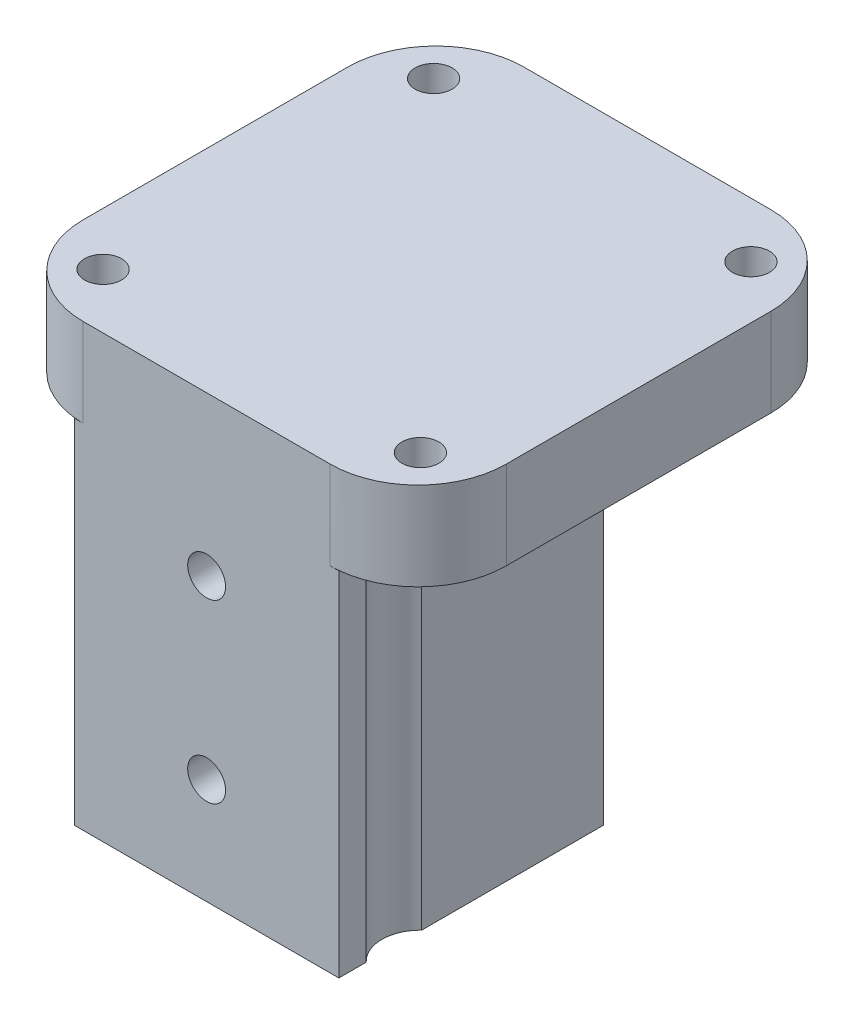
ISO-10303-21;
HEADER;
FILE_DESCRIPTION(('STEP AP214'),'2;1');
FILE_NAME('part.step','',(''),(''),'','','');
FILE_SCHEMA(('AUTOMOTIVE_DESIGN { 1 0 10303 214 1 1 1 1 }'));
ENDSEC;
DATA;
#1=APPLICATION_CONTEXT('core data for automotive mechanical design processes');
#2=APPLICATION_PROTOCOL_DEFINITION('international standard','automotive_design',2000,#1);
#3=PRODUCT_CONTEXT('',#1,'mechanical');
#4=PRODUCT('Part','Part','',(#3));
#5=PRODUCT_RELATED_PRODUCT_CATEGORY('part','',(#4));
#6=PRODUCT_DEFINITION_FORMATION('','',#4);
#7=PRODUCT_DEFINITION_CONTEXT('part definition',#1,'design');
#8=PRODUCT_DEFINITION('design','',#6,#7);
#9=PRODUCT_DEFINITION_SHAPE('','',#8);
#10=(LENGTH_UNIT() NAMED_UNIT(*) SI_UNIT(.MILLI.,.METRE.));
#11=(NAMED_UNIT(*) PLANE_ANGLE_UNIT() SI_UNIT($,.RADIAN.));
#12=(NAMED_UNIT(*) SI_UNIT($,.STERADIAN.) SOLID_ANGLE_UNIT());
#13=UNCERTAINTY_MEASURE_WITH_UNIT(LENGTH_MEASURE(1.E-05),#10,'distance_accuracy_value','');
#14=(GEOMETRIC_REPRESENTATION_CONTEXT(3) GLOBAL_UNCERTAINTY_ASSIGNED_CONTEXT((#13)) GLOBAL_UNIT_ASSIGNED_CONTEXT((#10,
#11,#12)) REPRESENTATION_CONTEXT('',''));
#15=CARTESIAN_POINT('',(0.,0.,0.));
#16=DIRECTION('',(0.,0.,1.));
#17=DIRECTION('',(1.,0.,0.));
#18=AXIS2_PLACEMENT_3D('',#15,#16,#17);
#19=CARTESIAN_POINT('',(0.,-40.,0.));
#20=DIRECTION('',(0.,-1.,0.));
#21=DIRECTION('',(0.,0.,-1.));
#22=AXIS2_PLACEMENT_3D('',#19,#20,#21);
#23=PLANE('',#22);
#24=DIRECTION('',(-1.,0.,0.));
#25=VECTOR('',#24,1.);
#26=CARTESIAN_POINT('',(-10.,-40.,20.));
#27=LINE('',#26,#25);
#28=CARTESIAN_POINT('',(10.,-40.,20.));
#29=VERTEX_POINT('',#28);
#30=CARTESIAN_POINT('',(-10.,-40.,20.));
#31=VERTEX_POINT('',#30);
#32=EDGE_CURVE('E271',#29,#31,#27,.T.);
#33=ORIENTED_EDGE('',*,*,#32,.F.);
#34=DIRECTION('',(0.,0.,1.));
#35=VECTOR('',#34,1.);
#36=CARTESIAN_POINT('',(10.,-40.,20.));
#37=LINE('',#36,#35);
#38=CARTESIAN_POINT('',(10.,-40.,0.));
#39=VERTEX_POINT('',#38);
#40=EDGE_CURVE('E260',#39,#29,#37,.T.);
#41=ORIENTED_EDGE('',*,*,#40,.F.);
#42=DIRECTION('',(1.,0.,0.));
#43=VECTOR('',#42,1.);
#44=CARTESIAN_POINT('',(-10.,-40.,0.));
#45=LINE('',#44,#43);
#46=CARTESIAN_POINT('',(-10.,-40.,0.));
#47=VERTEX_POINT('',#46);
#48=EDGE_CURVE('E251',#47,#39,#45,.T.);
#49=ORIENTED_EDGE('',*,*,#48,.F.);
#50=DIRECTION('',(0.,0.,-1.));
#51=VECTOR('',#50,1.);
#52=CARTESIAN_POINT('',(-10.,-40.,20.));
#53=LINE('',#52,#51);
#54=EDGE_CURVE('E266',#31,#47,#53,.T.);
#55=ORIENTED_EDGE('',*,*,#54,.F.);
#56=EDGE_LOOP('',(#33,#41,#49,#55));
#57=FACE_BOUND('',#56,.T.);
#58=CARTESIAN_POINT('',(18.,-40.,18.75));
#59=DIRECTION('',(0.,-1.,0.));
#60=DIRECTION('',(0.,0.,-1.));
#61=AXIS2_PLACEMENT_3D('',#58,#59,#60);
#62=CIRCLE('',#61,4.35);
#63=CARTESIAN_POINT('',(15.,-40.,21.9));
#64=VERTEX_POINT('',#63);
#65=CARTESIAN_POINT('',(15.,-40.,15.6));
#66=VERTEX_POINT('',#65);
#67=EDGE_CURVE('E267',#64,#66,#62,.T.);
#68=ORIENTED_EDGE('',*,*,#67,.F.);
#69=DIRECTION('',(0.,0.,1.));
#70=VECTOR('',#69,1.);
#71=CARTESIAN_POINT('',(15.,-40.,25.));
#72=LINE('',#71,#70);
#73=CARTESIAN_POINT('',(15.,-40.,25.));
#74=VERTEX_POINT('',#73);
#75=EDGE_CURVE('E218',#64,#74,#72,.T.);
#76=ORIENTED_EDGE('',*,*,#75,.T.);
#77=DIRECTION('',(-1.,0.,0.));
#78=VECTOR('',#77,1.);
#79=CARTESIAN_POINT('',(-15.,-40.,25.));
#80=LINE('',#79,#78);
#81=CARTESIAN_POINT('',(-15.,-40.,25.));
#82=VERTEX_POINT('',#81);
#83=EDGE_CURVE('E245',#74,#82,#80,.T.);
#84=ORIENTED_EDGE('',*,*,#83,.T.);
#85=DIRECTION('',(0.,0.,-1.));
#86=VECTOR('',#85,1.);
#87=CARTESIAN_POINT('',(-15.,-40.,25.));
#88=LINE('',#87,#86);
#89=CARTESIAN_POINT('',(-15.,-40.,21.9));
#90=VERTEX_POINT('',#89);
#91=EDGE_CURVE('E237',#82,#90,#88,.T.);
#92=ORIENTED_EDGE('',*,*,#91,.T.);
#93=CARTESIAN_POINT('',(-18.,-40.,18.75));
#94=DIRECTION('',(0.,-1.,0.));
#95=DIRECTION('',(0.,0.,-1.));
#96=AXIS2_PLACEMENT_3D('',#93,#94,#95);
#97=CIRCLE('',#96,4.35);
#98=CARTESIAN_POINT('',(-15.,-40.,15.6));
#99=VERTEX_POINT('',#98);
#100=EDGE_CURVE('E196',#99,#90,#97,.T.);
#101=ORIENTED_EDGE('',*,*,#100,.F.);
#102=CARTESIAN_POINT('',(-15.,-40.,-5.));
#103=VERTEX_POINT('',#102);
#104=EDGE_CURVE('E203',#99,#103,#88,.T.);
#105=ORIENTED_EDGE('',*,*,#104,.T.);
#106=DIRECTION('',(1.,0.,0.));
#107=VECTOR('',#106,1.);
#108=CARTESIAN_POINT('',(-15.,-40.,-5.));
#109=LINE('',#108,#107);
#110=CARTESIAN_POINT('',(15.,-40.,-5.));
#111=VERTEX_POINT('',#110);
#112=EDGE_CURVE('E236',#103,#111,#109,.T.);
#113=ORIENTED_EDGE('',*,*,#112,.T.);
#114=EDGE_CURVE('E225',#111,#66,#72,.T.);
#115=ORIENTED_EDGE('',*,*,#114,.T.);
#116=EDGE_LOOP('',(#68,#76,#84,#92,#101,#105,#113,#115));
#117=FACE_BOUND('',#116,.T.);
#118=ADVANCED_FACE('F39',(#57,#117),#23,.T.);
#119=CARTESIAN_POINT('',(15.,-40.,25.));
#120=DIRECTION('',(-1.,0.,0.));
#121=DIRECTION('',(0.,0.,1.));
#122=AXIS2_PLACEMENT_3D('',#119,#120,#121);
#123=PLANE('',#122);
#124=DIRECTION('',(0.,1.,0.));
#125=VECTOR('',#124,1.);
#126=CARTESIAN_POINT('',(15.,-40.,21.9));
#127=LINE('',#126,#125);
#128=CARTESIAN_POINT('',(15.,0.,21.9));
#129=VERTEX_POINT('',#128);
#130=EDGE_CURVE('E370',#129,#64,#127,.F.);
#131=ORIENTED_EDGE('',*,*,#130,.F.);
#132=DIRECTION('',(0.,0.,1.));
#133=VECTOR('',#132,1.);
#134=CARTESIAN_POINT('',(15.,0.,25.));
#135=LINE('',#134,#133);
#136=CARTESIAN_POINT('',(15.,0.,24.9498743710662));
#137=VERTEX_POINT('',#136);
#138=EDGE_CURVE('E234',#129,#137,#135,.T.);
#139=ORIENTED_EDGE('',*,*,#138,.T.);
#140=CARTESIAN_POINT('',(15.,0.,25.));
#141=VERTEX_POINT('',#140);
#142=EDGE_CURVE('E232',#137,#141,#135,.T.);
#143=ORIENTED_EDGE('',*,*,#142,.T.);
#144=DIRECTION('',(0.,1.,0.));
#145=VECTOR('',#144,1.);
#146=CARTESIAN_POINT('',(15.,-40.,25.));
#147=LINE('',#146,#145);
#148=EDGE_CURVE('E386',#74,#141,#147,.T.);
#149=ORIENTED_EDGE('',*,*,#148,.F.);
#150=ORIENTED_EDGE('',*,*,#75,.F.);
#151=EDGE_LOOP('',(#131,#139,#143,#149,#150));
#152=FACE_BOUND('',#151,.T.);
#153=ADVANCED_FACE('F441',(#152),#123,.F.);
#154=DIRECTION('',(0.,1.,0.));
#155=VECTOR('',#154,1.);
#156=CARTESIAN_POINT('',(15.,-40.,15.6));
#157=LINE('',#156,#155);
#158=CARTESIAN_POINT('',(15.,0.,15.6));
#159=VERTEX_POINT('',#158);
#160=EDGE_CURVE('E204',#66,#159,#157,.T.);
#161=ORIENTED_EDGE('',*,*,#160,.F.);
#162=ORIENTED_EDGE('',*,*,#114,.F.);
#163=DIRECTION('',(0.,1.,0.));
#164=VECTOR('',#163,1.);
#165=CARTESIAN_POINT('',(15.,-40.,-5.));
#166=LINE('',#165,#164);
#167=CARTESIAN_POINT('',(15.,-10.,-5.));
#168=VERTEX_POINT('',#167);
#169=EDGE_CURVE('E238',#111,#168,#166,.T.);
#170=ORIENTED_EDGE('',*,*,#169,.T.);
#171=CARTESIAN_POINT('',(15.,-10.,-15.));
#172=DIRECTION('',(-1.,0.,0.));
#173=DIRECTION('',(0.,0.,1.));
#174=AXIS2_PLACEMENT_3D('',#171,#172,#173);
#175=CIRCLE('',#174,10.);
#176=CARTESIAN_POINT('',(15.,0.,-15.));
#177=VERTEX_POINT('',#176);
#178=EDGE_CURVE('E50',#168,#177,#175,.T.);
#179=ORIENTED_EDGE('',*,*,#178,.T.);
#180=EDGE_CURVE('E53',#177,#159,#135,.T.);
#181=ORIENTED_EDGE('',*,*,#180,.T.);
#182=EDGE_LOOP('',(#161,#162,#170,#179,#181));
#183=FACE_BOUND('',#182,.T.);
#184=ADVANCED_FACE('F374',(#183),#123,.F.);
#185=CARTESIAN_POINT('',(-15.,-40.,25.));
#186=DIRECTION('',(1.,0.,0.));
#187=DIRECTION('',(0.,0.,-1.));
#188=AXIS2_PLACEMENT_3D('',#185,#186,#187);
#189=PLANE('',#188);
#190=DIRECTION('',(0.,1.,0.));
#191=VECTOR('',#190,1.);
#192=CARTESIAN_POINT('',(-15.,-40.,15.6));
#193=LINE('',#192,#191);
#194=CARTESIAN_POINT('',(-15.,0.,15.6));
#195=VERTEX_POINT('',#194);
#196=EDGE_CURVE('E188',#195,#99,#193,.F.);
#197=ORIENTED_EDGE('',*,*,#196,.F.);
#198=DIRECTION('',(0.,0.,-1.));
#199=VECTOR('',#198,1.);
#200=CARTESIAN_POINT('',(-15.,0.,25.));
#201=LINE('',#200,#199);
#202=CARTESIAN_POINT('',(-15.,0.,-15.));
#203=VERTEX_POINT('',#202);
#204=EDGE_CURVE('E64',#195,#203,#201,.T.);
#205=ORIENTED_EDGE('',*,*,#204,.T.);
#206=CARTESIAN_POINT('',(-15.,-10.,-15.));
#207=DIRECTION('',(1.,0.,0.));
#208=DIRECTION('',(0.,0.,-1.));
#209=AXIS2_PLACEMENT_3D('',#206,#207,#208);
#210=CIRCLE('',#209,10.);
#211=CARTESIAN_POINT('',(-15.,-10.,-5.));
#212=VERTEX_POINT('',#211);
#213=EDGE_CURVE('E11',#203,#212,#210,.T.);
#214=ORIENTED_EDGE('',*,*,#213,.T.);
#215=DIRECTION('',(0.,1.,0.));
#216=VECTOR('',#215,1.);
#217=CARTESIAN_POINT('',(-15.,-40.,-5.));
#218=LINE('',#217,#216);
#219=EDGE_CURVE('E382',#103,#212,#218,.T.);
#220=ORIENTED_EDGE('',*,*,#219,.F.);
#221=ORIENTED_EDGE('',*,*,#104,.F.);
#222=EDGE_LOOP('',(#197,#205,#214,#220,#221));
#223=FACE_BOUND('',#222,.T.);
#224=ADVANCED_FACE('F198',(#223),#189,.F.);
#225=DIRECTION('',(0.,1.,0.));
#226=VECTOR('',#225,1.);
#227=CARTESIAN_POINT('',(-15.,-40.,21.9));
#228=LINE('',#227,#226);
#229=CARTESIAN_POINT('',(-15.,0.,21.9));
#230=VERTEX_POINT('',#229);
#231=EDGE_CURVE('E195',#90,#230,#228,.T.);
#232=ORIENTED_EDGE('',*,*,#231,.F.);
#233=ORIENTED_EDGE('',*,*,#91,.F.);
#234=DIRECTION('',(0.,1.,0.));
#235=VECTOR('',#234,1.);
#236=CARTESIAN_POINT('',(-15.,-40.,25.));
#237=LINE('',#236,#235);
#238=CARTESIAN_POINT('',(-15.,0.,25.));
#239=VERTEX_POINT('',#238);
#240=EDGE_CURVE('E383',#82,#239,#237,.T.);
#241=ORIENTED_EDGE('',*,*,#240,.T.);
#242=CARTESIAN_POINT('',(-15.,0.,24.9498743710662));
#243=VERTEX_POINT('',#242);
#244=EDGE_CURVE('E211',#239,#243,#201,.T.);
#245=ORIENTED_EDGE('',*,*,#244,.T.);
#246=EDGE_CURVE('E209',#243,#230,#201,.T.);
#247=ORIENTED_EDGE('',*,*,#246,.T.);
#248=EDGE_LOOP('',(#232,#233,#241,#245,#247));
#249=FACE_BOUND('',#248,.T.);
#250=ADVANCED_FACE('F462',(#249),#189,.F.);
#251=CARTESIAN_POINT('',(-14.,0.,15.));
#252=DIRECTION('',(0.,1.,0.));
#253=DIRECTION('',(0.,0.,1.));
#254=AXIS2_PLACEMENT_3D('',#251,#252,#253);
#255=PLANE('',#254);
#256=ORIENTED_EDGE('',*,*,#180,.F.);
#257=DIRECTION('',(1.,0.,0.));
#258=VECTOR('',#257,1.);
#259=CARTESIAN_POINT('',(-15.,0.,-15.));
#260=LINE('',#259,#258);
#261=EDGE_CURVE('E210',#177,#203,#260,.F.);
#262=ORIENTED_EDGE('',*,*,#261,.T.);
#263=ORIENTED_EDGE('',*,*,#204,.F.);
#264=CARTESIAN_POINT('',(-18.,0.,18.75));
#265=DIRECTION('',(0.,-1.,0.));
#266=DIRECTION('',(0.,0.,-1.));
#267=AXIS2_PLACEMENT_3D('',#264,#265,#266);
#268=CIRCLE('',#267,4.35);
#269=EDGE_CURVE('E189',#195,#230,#268,.T.);
#270=ORIENTED_EDGE('',*,*,#269,.T.);
#271=ORIENTED_EDGE('',*,*,#246,.F.);
#272=CARTESIAN_POINT('',(-14.,0.,15.));
#273=DIRECTION('',(0.,1.,0.));
#274=DIRECTION('',(0.,0.,1.));
#275=AXIS2_PLACEMENT_3D('',#272,#273,#274);
#276=CIRCLE('',#275,10.);
#277=CARTESIAN_POINT('',(-24.,0.,15.));
#278=VERTEX_POINT('',#277);
#279=EDGE_CURVE('E324',#278,#243,#276,.T.);
#280=ORIENTED_EDGE('',*,*,#279,.F.);
#281=DIRECTION('',(0.,0.,1.));
#282=VECTOR('',#281,1.);
#283=CARTESIAN_POINT('',(-24.,0.,-15.));
#284=LINE('',#283,#282);
#285=CARTESIAN_POINT('',(-24.,0.,-15.));
#286=VERTEX_POINT('',#285);
#287=EDGE_CURVE('E345',#286,#278,#284,.T.);
#288=ORIENTED_EDGE('',*,*,#287,.F.);
#289=CARTESIAN_POINT('',(-14.,0.,-15.));
#290=DIRECTION('',(0.,1.,0.));
#291=DIRECTION('',(0.,0.,1.));
#292=AXIS2_PLACEMENT_3D('',#289,#290,#291);
#293=CIRCLE('',#292,10.);
#294=CARTESIAN_POINT('',(-14.,0.,-25.));
#295=VERTEX_POINT('',#294);
#296=EDGE_CURVE('E344',#295,#286,#293,.T.);
#297=ORIENTED_EDGE('',*,*,#296,.F.);
#298=DIRECTION('',(-1.,0.,0.));
#299=VECTOR('',#298,1.);
#300=CARTESIAN_POINT('',(-14.,0.,-25.));
#301=LINE('',#300,#299);
#302=CARTESIAN_POINT('',(14.,0.,-25.));
#303=VERTEX_POINT('',#302);
#304=EDGE_CURVE('E339',#303,#295,#301,.T.);
#305=ORIENTED_EDGE('',*,*,#304,.F.);
#306=CARTESIAN_POINT('',(14.,0.,-15.));
#307=DIRECTION('',(0.,1.,0.));
#308=DIRECTION('',(0.,0.,-1.));
#309=AXIS2_PLACEMENT_3D('',#306,#307,#308);
#310=CIRCLE('',#309,10.);
#311=CARTESIAN_POINT('',(24.,0.,-15.));
#312=VERTEX_POINT('',#311);
#313=EDGE_CURVE('E340',#312,#303,#310,.T.);
#314=ORIENTED_EDGE('',*,*,#313,.F.);
#315=DIRECTION('',(0.,0.,-1.));
#316=VECTOR('',#315,1.);
#317=CARTESIAN_POINT('',(24.,0.,-15.));
#318=LINE('',#317,#316);
#319=CARTESIAN_POINT('',(24.,0.,15.));
#320=VERTEX_POINT('',#319);
#321=EDGE_CURVE('E331',#320,#312,#318,.T.);
#322=ORIENTED_EDGE('',*,*,#321,.F.);
#323=CARTESIAN_POINT('',(14.,0.,15.));
#324=DIRECTION('',(0.,1.,0.));
#325=DIRECTION('',(0.,0.,1.));
#326=AXIS2_PLACEMENT_3D('',#323,#324,#325);
#327=CIRCLE('',#326,10.);
#328=EDGE_CURVE('E323',#137,#320,#327,.T.);
#329=ORIENTED_EDGE('',*,*,#328,.F.);
#330=ORIENTED_EDGE('',*,*,#138,.F.);
#331=CARTESIAN_POINT('',(18.,0.,18.75));
#332=DIRECTION('',(0.,-1.,0.));
#333=DIRECTION('',(0.,0.,-1.));
#334=AXIS2_PLACEMENT_3D('',#331,#332,#333);
#335=CIRCLE('',#334,4.35);
#336=EDGE_CURVE('E192',#129,#159,#335,.T.);
#337=ORIENTED_EDGE('',*,*,#336,.T.);
#338=EDGE_LOOP('',(#256,#262,#263,#270,#271,#280,#288,#297,#305,#314,#322,#329,#330,#337));
#339=FACE_BOUND('',#338,.T.);
#340=CARTESIAN_POINT('',(-18.,0.,-18.75));
#341=DIRECTION('',(0.,1.,0.));
#342=DIRECTION('',(0.,0.,1.));
#343=AXIS2_PLACEMENT_3D('',#340,#341,#342);
#344=CIRCLE('',#343,2.1);
#345=CARTESIAN_POINT('',(-18.,0.,-16.65));
#346=VERTEX_POINT('',#345);
#347=EDGE_CURVE('E326',#346,#346,#344,.T.);
#348=ORIENTED_EDGE('',*,*,#347,.T.);
#349=EDGE_LOOP('',(#348));
#350=FACE_BOUND('',#349,.T.);
#351=CARTESIAN_POINT('',(18.,0.,-18.75));
#352=DIRECTION('',(0.,1.,0.));
#353=DIRECTION('',(0.,0.,1.));
#354=AXIS2_PLACEMENT_3D('',#351,#352,#353);
#355=CIRCLE('',#354,2.1);
#356=CARTESIAN_POINT('',(18.,0.,-16.65));
#357=VERTEX_POINT('',#356);
#358=EDGE_CURVE('E402',#357,#357,#355,.T.);
#359=ORIENTED_EDGE('',*,*,#358,.T.);
#360=EDGE_LOOP('',(#359));
#361=FACE_BOUND('',#360,.T.);
#362=CARTESIAN_POINT('',(-18.,0.,18.75));
#363=DIRECTION('',(0.,1.,0.));
#364=DIRECTION('',(0.,0.,1.));
#365=AXIS2_PLACEMENT_3D('',#362,#363,#364);
#366=CIRCLE('',#365,2.1);
#367=CARTESIAN_POINT('',(-18.,0.,20.85));
#368=VERTEX_POINT('',#367);
#369=EDGE_CURVE('E391',#368,#368,#366,.T.);
#370=ORIENTED_EDGE('',*,*,#369,.T.);
#371=EDGE_LOOP('',(#370));
#372=FACE_BOUND('',#371,.T.);
#373=CARTESIAN_POINT('',(18.,0.,18.75));
#374=DIRECTION('',(0.,1.,0.));
#375=DIRECTION('',(0.,0.,1.));
#376=AXIS2_PLACEMENT_3D('',#373,#374,#375);
#377=CIRCLE('',#376,2.1);
#378=CARTESIAN_POINT('',(18.,0.,20.85));
#379=VERTEX_POINT('',#378);
#380=EDGE_CURVE('E394',#379,#379,#377,.T.);
#381=ORIENTED_EDGE('',*,*,#380,.T.);
#382=EDGE_LOOP('',(#381));
#383=FACE_BOUND('',#382,.T.);
#384=ADVANCED_FACE('F205',(#339,#350,#361,#372,#383),#255,.F.);
#385=CARTESIAN_POINT('',(-14.,10.,15.));
#386=DIRECTION('',(0.,1.,0.));
#387=DIRECTION('',(0.,0.,1.));
#388=AXIS2_PLACEMENT_3D('',#385,#386,#387);
#389=PLANE('',#388);
#390=CARTESIAN_POINT('',(18.,10.,18.75));
#391=DIRECTION('',(0.,1.,0.));
#392=DIRECTION('',(0.,0.,1.));
#393=AXIS2_PLACEMENT_3D('',#390,#391,#392);
#394=CIRCLE('',#393,2.1);
#395=CARTESIAN_POINT('',(18.,10.,20.85));
#396=VERTEX_POINT('',#395);
#397=EDGE_CURVE('E397',#396,#396,#394,.T.);
#398=ORIENTED_EDGE('',*,*,#397,.F.);
#399=EDGE_LOOP('',(#398));
#400=FACE_BOUND('',#399,.T.);
#401=CARTESIAN_POINT('',(-18.,10.,-18.75));
#402=DIRECTION('',(0.,1.,0.));
#403=DIRECTION('',(0.,0.,1.));
#404=AXIS2_PLACEMENT_3D('',#401,#402,#403);
#405=CIRCLE('',#404,2.1);
#406=CARTESIAN_POINT('',(-18.,10.,-16.65));
#407=VERTEX_POINT('',#406);
#408=EDGE_CURVE('E321',#407,#407,#405,.T.);
#409=ORIENTED_EDGE('',*,*,#408,.F.);
#410=EDGE_LOOP('',(#409));
#411=FACE_BOUND('',#410,.T.);
#412=CARTESIAN_POINT('',(-14.,10.,15.));
#413=DIRECTION('',(0.,1.,0.));
#414=DIRECTION('',(0.,0.,1.));
#415=AXIS2_PLACEMENT_3D('',#412,#413,#414);
#416=CIRCLE('',#415,10.);
#417=CARTESIAN_POINT('',(-24.,10.,15.));
#418=VERTEX_POINT('',#417);
#419=CARTESIAN_POINT('',(-14.,10.,25.));
#420=VERTEX_POINT('',#419);
#421=EDGE_CURVE('E342',#418,#420,#416,.T.);
#422=ORIENTED_EDGE('',*,*,#421,.T.);
#423=DIRECTION('',(1.,0.,0.));
#424=VECTOR('',#423,1.);
#425=CARTESIAN_POINT('',(-14.,10.,25.));
#426=LINE('',#425,#424);
#427=CARTESIAN_POINT('',(14.,10.,25.));
#428=VERTEX_POINT('',#427);
#429=EDGE_CURVE('E315',#420,#428,#426,.T.);
#430=ORIENTED_EDGE('',*,*,#429,.T.);
#431=CARTESIAN_POINT('',(14.,10.,15.));
#432=DIRECTION('',(0.,1.,0.));
#433=DIRECTION('',(0.,0.,1.));
#434=AXIS2_PLACEMENT_3D('',#431,#432,#433);
#435=CIRCLE('',#434,10.);
#436=CARTESIAN_POINT('',(24.,10.,15.));
#437=VERTEX_POINT('',#436);
#438=EDGE_CURVE('E412',#428,#437,#435,.T.);
#439=ORIENTED_EDGE('',*,*,#438,.T.);
#440=DIRECTION('',(0.,0.,-1.));
#441=VECTOR('',#440,1.);
#442=CARTESIAN_POINT('',(24.,10.,-15.));
#443=LINE('',#442,#441);
#444=CARTESIAN_POINT('',(24.,10.,-15.));
#445=VERTEX_POINT('',#444);
#446=EDGE_CURVE('E414',#437,#445,#443,.T.);
#447=ORIENTED_EDGE('',*,*,#446,.T.);
#448=CARTESIAN_POINT('',(14.,10.,-15.));
#449=DIRECTION('',(0.,1.,0.));
#450=DIRECTION('',(0.,0.,-1.));
#451=AXIS2_PLACEMENT_3D('',#448,#449,#450);
#452=CIRCLE('',#451,10.);
#453=CARTESIAN_POINT('',(14.,10.,-25.));
#454=VERTEX_POINT('',#453);
#455=EDGE_CURVE('E419',#445,#454,#452,.T.);
#456=ORIENTED_EDGE('',*,*,#455,.T.);
#457=DIRECTION('',(-1.,0.,0.));
#458=VECTOR('',#457,1.);
#459=CARTESIAN_POINT('',(-14.,10.,-25.));
#460=LINE('',#459,#458);
#461=CARTESIAN_POINT('',(-14.,10.,-25.));
#462=VERTEX_POINT('',#461);
#463=EDGE_CURVE('E420',#454,#462,#460,.T.);
#464=ORIENTED_EDGE('',*,*,#463,.T.);
#465=CARTESIAN_POINT('',(-14.,10.,-15.));
#466=DIRECTION('',(0.,1.,0.));
#467=DIRECTION('',(0.,0.,1.));
#468=AXIS2_PLACEMENT_3D('',#465,#466,#467);
#469=CIRCLE('',#468,10.);
#470=CARTESIAN_POINT('',(-24.,10.,-15.));
#471=VERTEX_POINT('',#470);
#472=EDGE_CURVE('E416',#462,#471,#469,.T.);
#473=ORIENTED_EDGE('',*,*,#472,.T.);
#474=DIRECTION('',(0.,0.,1.));
#475=VECTOR('',#474,1.);
#476=CARTESIAN_POINT('',(-24.,10.,-15.));
#477=LINE('',#476,#475);
#478=EDGE_CURVE('E329',#471,#418,#477,.T.);
#479=ORIENTED_EDGE('',*,*,#478,.T.);
#480=EDGE_LOOP('',(#422,#430,#439,#447,#456,#464,#473,#479));
#481=FACE_BOUND('',#480,.T.);
#482=CARTESIAN_POINT('',(18.,10.,-18.75));
#483=DIRECTION('',(0.,1.,0.));
#484=DIRECTION('',(0.,0.,1.));
#485=AXIS2_PLACEMENT_3D('',#482,#483,#484);
#486=CIRCLE('',#485,2.1);
#487=CARTESIAN_POINT('',(18.,10.,-16.65));
#488=VERTEX_POINT('',#487);
#489=EDGE_CURVE('E404',#488,#488,#486,.T.);
#490=ORIENTED_EDGE('',*,*,#489,.F.);
#491=EDGE_LOOP('',(#490));
#492=FACE_BOUND('',#491,.T.);
#493=CARTESIAN_POINT('',(-18.,10.,18.75));
#494=DIRECTION('',(0.,1.,0.));
#495=DIRECTION('',(0.,0.,1.));
#496=AXIS2_PLACEMENT_3D('',#493,#494,#495);
#497=CIRCLE('',#496,2.1);
#498=CARTESIAN_POINT('',(-18.,10.,20.85));
#499=VERTEX_POINT('',#498);
#500=EDGE_CURVE('E395',#499,#499,#497,.T.);
#501=ORIENTED_EDGE('',*,*,#500,.F.);
#502=EDGE_LOOP('',(#501));
#503=FACE_BOUND('',#502,.T.);
#504=ADVANCED_FACE('F428',(#400,#411,#481,#492,#503),#389,.T.);
#505=CARTESIAN_POINT('',(-14.,10.,15.));
#506=DIRECTION('',(0.,-1.,0.));
#507=DIRECTION('',(0.,0.,-1.));
#508=AXIS2_PLACEMENT_3D('',#505,#506,#507);
#509=CYLINDRICAL_SURFACE('',#508,10.);
#510=ORIENTED_EDGE('',*,*,#279,.T.);
#511=CARTESIAN_POINT('',(-14.,0.,25.));
#512=VERTEX_POINT('',#511);
#513=EDGE_CURVE('E316',#243,#512,#276,.T.);
#514=ORIENTED_EDGE('',*,*,#513,.T.);
#515=DIRECTION('',(0.,-1.,0.));
#516=VECTOR('',#515,1.);
#517=CARTESIAN_POINT('',(-14.,10.,25.));
#518=LINE('',#517,#516);
#519=EDGE_CURVE('E208',#420,#512,#518,.T.);
#520=ORIENTED_EDGE('',*,*,#519,.F.);
#521=ORIENTED_EDGE('',*,*,#421,.F.);
#522=DIRECTION('',(0.,-1.,0.));
#523=VECTOR('',#522,1.);
#524=CARTESIAN_POINT('',(-24.,10.,15.));
#525=LINE('',#524,#523);
#526=EDGE_CURVE('E346',#418,#278,#525,.T.);
#527=ORIENTED_EDGE('',*,*,#526,.T.);
#528=EDGE_LOOP('',(#510,#514,#520,#521,#527));
#529=FACE_BOUND('',#528,.T.);
#530=ADVANCED_FACE('F306',(#529),#509,.T.);
#531=CARTESIAN_POINT('',(-14.,10.,25.));
#532=DIRECTION('',(0.,0.,-1.));
#533=DIRECTION('',(-1.,0.,0.));
#534=AXIS2_PLACEMENT_3D('',#531,#532,#533);
#535=PLANE('',#534);
#536=CARTESIAN_POINT('',(0.,-8.,25.));
#537=DIRECTION('',(0.,0.,1.));
#538=DIRECTION('',(1.,0.,0.));
#539=AXIS2_PLACEMENT_3D('',#536,#537,#538);
#540=CIRCLE('',#539,2.15);
#541=CARTESIAN_POINT('',(2.15,-8.,25.));
#542=VERTEX_POINT('',#541);
#543=EDGE_CURVE('E279',#542,#542,#540,.T.);
#544=ORIENTED_EDGE('',*,*,#543,.F.);
#545=EDGE_LOOP('',(#544));
#546=FACE_BOUND('',#545,.T.);
#547=CARTESIAN_POINT('',(0.,-28.,25.));
#548=DIRECTION('',(0.,0.,1.));
#549=DIRECTION('',(1.,0.,0.));
#550=AXIS2_PLACEMENT_3D('',#547,#548,#549);
#551=CIRCLE('',#550,2.15);
#552=CARTESIAN_POINT('',(2.15,-28.,25.));
#553=VERTEX_POINT('',#552);
#554=EDGE_CURVE('E283',#553,#553,#551,.T.);
#555=ORIENTED_EDGE('',*,*,#554,.F.);
#556=EDGE_LOOP('',(#555));
#557=FACE_BOUND('',#556,.T.);
#558=ORIENTED_EDGE('',*,*,#519,.T.);
#559=DIRECTION('',(-1.,0.,0.));
#560=VECTOR('',#559,1.);
#561=CARTESIAN_POINT('',(-15.,0.,25.));
#562=LINE('',#561,#560);
#563=EDGE_CURVE('E227',#512,#239,#562,.T.);
#564=ORIENTED_EDGE('',*,*,#563,.T.);
#565=ORIENTED_EDGE('',*,*,#240,.F.);
#566=ORIENTED_EDGE('',*,*,#83,.F.);
#567=ORIENTED_EDGE('',*,*,#148,.T.);
#568=CARTESIAN_POINT('',(14.,0.,25.));
#569=VERTEX_POINT('',#568);
#570=EDGE_CURVE('E219',#141,#569,#562,.T.);
#571=ORIENTED_EDGE('',*,*,#570,.T.);
#572=DIRECTION('',(0.,-1.,0.));
#573=VECTOR('',#572,1.);
#574=CARTESIAN_POINT('',(14.,10.,25.));
#575=LINE('',#574,#573);
#576=EDGE_CURVE('E213',#428,#569,#575,.T.);
#577=ORIENTED_EDGE('',*,*,#576,.F.);
#578=ORIENTED_EDGE('',*,*,#429,.F.);
#579=EDGE_LOOP('',(#558,#564,#565,#566,#567,#571,#577,#578));
#580=FACE_BOUND('',#579,.T.);
#581=ADVANCED_FACE('F305',(#546,#557,#580),#535,.F.);
#582=CARTESIAN_POINT('',(14.,10.,15.));
#583=DIRECTION('',(0.,-1.,0.));
#584=DIRECTION('',(0.,0.,-1.));
#585=AXIS2_PLACEMENT_3D('',#582,#583,#584);
#586=CYLINDRICAL_SURFACE('',#585,10.);
#587=EDGE_CURVE('E334',#569,#137,#327,.T.);
#588=ORIENTED_EDGE('',*,*,#587,.T.);
#589=ORIENTED_EDGE('',*,*,#328,.T.);
#590=DIRECTION('',(0.,-1.,0.));
#591=VECTOR('',#590,1.);
#592=CARTESIAN_POINT('',(24.,10.,15.));
#593=LINE('',#592,#591);
#594=EDGE_CURVE('E363',#437,#320,#593,.T.);
#595=ORIENTED_EDGE('',*,*,#594,.F.);
#596=ORIENTED_EDGE('',*,*,#438,.F.);
#597=ORIENTED_EDGE('',*,*,#576,.T.);
#598=EDGE_LOOP('',(#588,#589,#595,#596,#597));
#599=FACE_BOUND('',#598,.T.);
#600=ADVANCED_FACE('F304',(#599),#586,.T.);
#601=CARTESIAN_POINT('',(24.,10.,-15.));
#602=DIRECTION('',(-1.,0.,0.));
#603=DIRECTION('',(0.,0.,1.));
#604=AXIS2_PLACEMENT_3D('',#601,#602,#603);
#605=PLANE('',#604);
#606=ORIENTED_EDGE('',*,*,#321,.T.);
#607=DIRECTION('',(0.,-1.,0.));
#608=VECTOR('',#607,1.);
#609=CARTESIAN_POINT('',(24.,10.,-15.));
#610=LINE('',#609,#608);
#611=EDGE_CURVE('E356',#445,#312,#610,.T.);
#612=ORIENTED_EDGE('',*,*,#611,.F.);
#613=ORIENTED_EDGE('',*,*,#446,.F.);
#614=ORIENTED_EDGE('',*,*,#594,.T.);
#615=EDGE_LOOP('',(#606,#612,#613,#614));
#616=FACE_BOUND('',#615,.T.);
#617=ADVANCED_FACE('F500',(#616),#605,.F.);
#618=CARTESIAN_POINT('',(14.,10.,-15.));
#619=DIRECTION('',(0.,-1.,0.));
#620=DIRECTION('',(0.,0.,-1.));
#621=AXIS2_PLACEMENT_3D('',#618,#619,#620);
#622=CYLINDRICAL_SURFACE('',#621,10.);
#623=ORIENTED_EDGE('',*,*,#313,.T.);
#624=DIRECTION('',(0.,-1.,0.));
#625=VECTOR('',#624,1.);
#626=CARTESIAN_POINT('',(14.,10.,-25.));
#627=LINE('',#626,#625);
#628=EDGE_CURVE('E351',#454,#303,#627,.T.);
#629=ORIENTED_EDGE('',*,*,#628,.F.);
#630=ORIENTED_EDGE('',*,*,#455,.F.);
#631=ORIENTED_EDGE('',*,*,#611,.T.);
#632=EDGE_LOOP('',(#623,#629,#630,#631));
#633=FACE_BOUND('',#632,.T.);
#634=ADVANCED_FACE('F491',(#633),#622,.T.);
#635=CARTESIAN_POINT('',(-14.,10.,-25.));
#636=DIRECTION('',(0.,0.,1.));
#637=DIRECTION('',(1.,0.,0.));
#638=AXIS2_PLACEMENT_3D('',#635,#636,#637);
#639=PLANE('',#638);
#640=ORIENTED_EDGE('',*,*,#304,.T.);
#641=DIRECTION('',(0.,-1.,0.));
#642=VECTOR('',#641,1.);
#643=CARTESIAN_POINT('',(-14.,10.,-25.));
#644=LINE('',#643,#642);
#645=EDGE_CURVE('E354',#462,#295,#644,.T.);
#646=ORIENTED_EDGE('',*,*,#645,.F.);
#647=ORIENTED_EDGE('',*,*,#463,.F.);
#648=ORIENTED_EDGE('',*,*,#628,.T.);
#649=EDGE_LOOP('',(#640,#646,#647,#648));
#650=FACE_BOUND('',#649,.T.);
#651=ADVANCED_FACE('F490',(#650),#639,.F.);
#652=CARTESIAN_POINT('',(-14.,10.,-15.));
#653=DIRECTION('',(0.,-1.,0.));
#654=DIRECTION('',(0.,0.,-1.));
#655=AXIS2_PLACEMENT_3D('',#652,#653,#654);
#656=CYLINDRICAL_SURFACE('',#655,10.);
#657=ORIENTED_EDGE('',*,*,#296,.T.);
#658=DIRECTION('',(0.,-1.,0.));
#659=VECTOR('',#658,1.);
#660=CARTESIAN_POINT('',(-24.,10.,-15.));
#661=LINE('',#660,#659);
#662=EDGE_CURVE('E348',#471,#286,#661,.T.);
#663=ORIENTED_EDGE('',*,*,#662,.F.);
#664=ORIENTED_EDGE('',*,*,#472,.F.);
#665=ORIENTED_EDGE('',*,*,#645,.T.);
#666=EDGE_LOOP('',(#657,#663,#664,#665));
#667=FACE_BOUND('',#666,.T.);
#668=ADVANCED_FACE('F488',(#667),#656,.T.);
#669=CARTESIAN_POINT('',(-24.,10.,-15.));
#670=DIRECTION('',(1.,0.,0.));
#671=DIRECTION('',(0.,0.,-1.));
#672=AXIS2_PLACEMENT_3D('',#669,#670,#671);
#673=PLANE('',#672);
#674=ORIENTED_EDGE('',*,*,#287,.T.);
#675=ORIENTED_EDGE('',*,*,#526,.F.);
#676=ORIENTED_EDGE('',*,*,#478,.F.);
#677=ORIENTED_EDGE('',*,*,#662,.T.);
#678=EDGE_LOOP('',(#674,#675,#676,#677));
#679=FACE_BOUND('',#678,.T.);
#680=ADVANCED_FACE('F429',(#679),#673,.F.);
#681=CARTESIAN_POINT('',(-18.,10.,-18.75));
#682=DIRECTION('',(0.,-1.,0.));
#683=DIRECTION('',(0.,0.,-1.));
#684=AXIS2_PLACEMENT_3D('',#681,#682,#683);
#685=CYLINDRICAL_SURFACE('',#684,2.1);
#686=ORIENTED_EDGE('',*,*,#408,.T.);
#687=EDGE_LOOP('',(#686));
#688=FACE_BOUND('',#687,.T.);
#689=ORIENTED_EDGE('',*,*,#347,.F.);
#690=EDGE_LOOP('',(#689));
#691=FACE_BOUND('',#690,.T.);
#692=ADVANCED_FACE('F472',(#688,#691),#685,.F.);
#693=CARTESIAN_POINT('',(18.,10.,-18.75));
#694=DIRECTION('',(0.,-1.,0.));
#695=DIRECTION('',(0.,0.,-1.));
#696=AXIS2_PLACEMENT_3D('',#693,#694,#695);
#697=CYLINDRICAL_SURFACE('',#696,2.1);
#698=ORIENTED_EDGE('',*,*,#489,.T.);
#699=EDGE_LOOP('',(#698));
#700=FACE_BOUND('',#699,.T.);
#701=ORIENTED_EDGE('',*,*,#358,.F.);
#702=EDGE_LOOP('',(#701));
#703=FACE_BOUND('',#702,.T.);
#704=ADVANCED_FACE('F474',(#700,#703),#697,.F.);
#705=CARTESIAN_POINT('',(18.,10.,18.75));
#706=DIRECTION('',(0.,-1.,0.));
#707=DIRECTION('',(0.,0.,-1.));
#708=AXIS2_PLACEMENT_3D('',#705,#706,#707);
#709=CYLINDRICAL_SURFACE('',#708,2.1);
#710=ORIENTED_EDGE('',*,*,#397,.T.);
#711=EDGE_LOOP('',(#710));
#712=FACE_BOUND('',#711,.T.);
#713=ORIENTED_EDGE('',*,*,#380,.F.);
#714=EDGE_LOOP('',(#713));
#715=FACE_BOUND('',#714,.T.);
#716=ADVANCED_FACE('F470',(#712,#715),#709,.F.);
#717=CARTESIAN_POINT('',(-18.,10.,18.75));
#718=DIRECTION('',(0.,-1.,0.));
#719=DIRECTION('',(0.,0.,-1.));
#720=AXIS2_PLACEMENT_3D('',#717,#718,#719);
#721=CYLINDRICAL_SURFACE('',#720,2.1);
#722=ORIENTED_EDGE('',*,*,#500,.T.);
#723=EDGE_LOOP('',(#722));
#724=FACE_BOUND('',#723,.T.);
#725=ORIENTED_EDGE('',*,*,#369,.F.);
#726=EDGE_LOOP('',(#725));
#727=FACE_BOUND('',#726,.T.);
#728=ADVANCED_FACE('F461',(#724,#727),#721,.F.);
#729=CARTESIAN_POINT('',(0.,0.,0.));
#730=DIRECTION('',(0.,-1.,0.));
#731=DIRECTION('',(0.,0.,-1.));
#732=AXIS2_PLACEMENT_3D('',#729,#730,#731);
#733=PLANE('',#732);
#734=ORIENTED_EDGE('',*,*,#513,.F.);
#735=ORIENTED_EDGE('',*,*,#244,.F.);
#736=ORIENTED_EDGE('',*,*,#563,.F.);
#737=EDGE_LOOP('',(#734,#735,#736));
#738=FACE_BOUND('',#737,.T.);
#739=ADVANCED_FACE('F319',(#738),#733,.F.);
#740=ORIENTED_EDGE('',*,*,#587,.F.);
#741=ORIENTED_EDGE('',*,*,#570,.F.);
#742=ORIENTED_EDGE('',*,*,#142,.F.);
#743=EDGE_LOOP('',(#740,#741,#742));
#744=FACE_BOUND('',#743,.T.);
#745=ADVANCED_FACE('F456',(#744),#733,.F.);
#746=CARTESIAN_POINT('',(-15.,-40.,-5.));
#747=DIRECTION('',(0.,0.,1.));
#748=DIRECTION('',(1.,0.,0.));
#749=AXIS2_PLACEMENT_3D('',#746,#747,#748);
#750=PLANE('',#749);
#751=ORIENTED_EDGE('',*,*,#219,.T.);
#752=DIRECTION('',(1.,0.,0.));
#753=VECTOR('',#752,1.);
#754=CARTESIAN_POINT('',(15.,-10.,-5.));
#755=LINE('',#754,#753);
#756=EDGE_CURVE('E367',#212,#168,#755,.T.);
#757=ORIENTED_EDGE('',*,*,#756,.T.);
#758=ORIENTED_EDGE('',*,*,#169,.F.);
#759=ORIENTED_EDGE('',*,*,#112,.F.);
#760=EDGE_LOOP('',(#751,#757,#758,#759));
#761=FACE_BOUND('',#760,.T.);
#762=ADVANCED_FACE('F381',(#761),#750,.F.);
#763=CARTESIAN_POINT('',(10.,-40.,20.));
#764=DIRECTION('',(-1.,0.,0.));
#765=DIRECTION('',(0.,0.,1.));
#766=AXIS2_PLACEMENT_3D('',#763,#764,#765);
#767=PLANE('',#766);
#768=DIRECTION('',(0.,0.,1.));
#769=VECTOR('',#768,1.);
#770=CARTESIAN_POINT('',(10.,0.,20.));
#771=LINE('',#770,#769);
#772=CARTESIAN_POINT('',(10.,0.,0.));
#773=VERTEX_POINT('',#772);
#774=CARTESIAN_POINT('',(10.,0.,20.));
#775=VERTEX_POINT('',#774);
#776=EDGE_CURVE('E264',#773,#775,#771,.T.);
#777=ORIENTED_EDGE('',*,*,#776,.F.);
#778=DIRECTION('',(0.,1.,0.));
#779=VECTOR('',#778,1.);
#780=CARTESIAN_POINT('',(10.,-40.,0.));
#781=LINE('',#780,#779);
#782=EDGE_CURVE('E255',#39,#773,#781,.T.);
#783=ORIENTED_EDGE('',*,*,#782,.F.);
#784=ORIENTED_EDGE('',*,*,#40,.T.);
#785=DIRECTION('',(0.,1.,0.));
#786=VECTOR('',#785,1.);
#787=CARTESIAN_POINT('',(10.,-40.,20.));
#788=LINE('',#787,#786);
#789=EDGE_CURVE('E244',#29,#775,#788,.T.);
#790=ORIENTED_EDGE('',*,*,#789,.T.);
#791=EDGE_LOOP('',(#777,#783,#784,#790));
#792=FACE_BOUND('',#791,.T.);
#793=ADVANCED_FACE('F453',(#792),#767,.T.);
#794=CARTESIAN_POINT('',(-10.,-40.,20.));
#795=DIRECTION('',(0.,0.,-1.));
#796=DIRECTION('',(-1.,0.,0.));
#797=AXIS2_PLACEMENT_3D('',#794,#795,#796);
#798=PLANE('',#797);
#799=CARTESIAN_POINT('',(0.,-8.,20.));
#800=DIRECTION('',(0.,0.,-1.));
#801=DIRECTION('',(-1.,0.,0.));
#802=AXIS2_PLACEMENT_3D('',#799,#800,#801);
#803=CIRCLE('',#802,2.15);
#804=CARTESIAN_POINT('',(-2.15,-8.,20.));
#805=VERTEX_POINT('',#804);
#806=EDGE_CURVE('E282',#805,#805,#803,.F.);
#807=ORIENTED_EDGE('',*,*,#806,.T.);
#808=EDGE_LOOP('',(#807));
#809=FACE_BOUND('',#808,.T.);
#810=CARTESIAN_POINT('',(0.,-28.,20.));
#811=DIRECTION('',(0.,0.,-1.));
#812=DIRECTION('',(-1.,0.,0.));
#813=AXIS2_PLACEMENT_3D('',#810,#811,#812);
#814=CIRCLE('',#813,2.15);
#815=CARTESIAN_POINT('',(-2.15,-28.,20.));
#816=VERTEX_POINT('',#815);
#817=EDGE_CURVE('E277',#816,#816,#814,.F.);
#818=ORIENTED_EDGE('',*,*,#817,.T.);
#819=EDGE_LOOP('',(#818));
#820=FACE_BOUND('',#819,.T.);
#821=DIRECTION('',(-1.,0.,0.));
#822=VECTOR('',#821,1.);
#823=CARTESIAN_POINT('',(-10.,0.,20.));
#824=LINE('',#823,#822);
#825=CARTESIAN_POINT('',(-10.,0.,20.));
#826=VERTEX_POINT('',#825);
#827=EDGE_CURVE('E265',#775,#826,#824,.T.);
#828=ORIENTED_EDGE('',*,*,#827,.F.);
#829=ORIENTED_EDGE('',*,*,#789,.F.);
#830=ORIENTED_EDGE('',*,*,#32,.T.);
#831=DIRECTION('',(0.,1.,0.));
#832=VECTOR('',#831,1.);
#833=CARTESIAN_POINT('',(-10.,-40.,20.));
#834=LINE('',#833,#832);
#835=EDGE_CURVE('E247',#31,#826,#834,.T.);
#836=ORIENTED_EDGE('',*,*,#835,.T.);
#837=EDGE_LOOP('',(#828,#829,#830,#836));
#838=FACE_BOUND('',#837,.T.);
#839=ADVANCED_FACE('F292',(#809,#820,#838),#798,.T.);
#840=CARTESIAN_POINT('',(-10.,-40.,20.));
#841=DIRECTION('',(1.,0.,0.));
#842=DIRECTION('',(0.,0.,-1.));
#843=AXIS2_PLACEMENT_3D('',#840,#841,#842);
#844=PLANE('',#843);
#845=DIRECTION('',(0.,0.,-1.));
#846=VECTOR('',#845,1.);
#847=CARTESIAN_POINT('',(-10.,0.,20.));
#848=LINE('',#847,#846);
#849=CARTESIAN_POINT('',(-10.,0.,0.));
#850=VERTEX_POINT('',#849);
#851=EDGE_CURVE('E258',#826,#850,#848,.T.);
#852=ORIENTED_EDGE('',*,*,#851,.F.);
#853=ORIENTED_EDGE('',*,*,#835,.F.);
#854=ORIENTED_EDGE('',*,*,#54,.T.);
#855=DIRECTION('',(0.,1.,0.));
#856=VECTOR('',#855,1.);
#857=CARTESIAN_POINT('',(-10.,-40.,0.));
#858=LINE('',#857,#856);
#859=EDGE_CURVE('E249',#47,#850,#858,.T.);
#860=ORIENTED_EDGE('',*,*,#859,.T.);
#861=EDGE_LOOP('',(#852,#853,#854,#860));
#862=FACE_BOUND('',#861,.T.);
#863=ADVANCED_FACE('F545',(#862),#844,.T.);
#864=CARTESIAN_POINT('',(-10.,-40.,0.));
#865=DIRECTION('',(0.,0.,1.));
#866=DIRECTION('',(1.,0.,0.));
#867=AXIS2_PLACEMENT_3D('',#864,#865,#866);
#868=PLANE('',#867);
#869=DIRECTION('',(1.,0.,0.));
#870=VECTOR('',#869,1.);
#871=CARTESIAN_POINT('',(-10.,0.,0.));
#872=LINE('',#871,#870);
#873=EDGE_CURVE('E253',#850,#773,#872,.T.);
#874=ORIENTED_EDGE('',*,*,#873,.F.);
#875=ORIENTED_EDGE('',*,*,#859,.F.);
#876=ORIENTED_EDGE('',*,*,#48,.T.);
#877=ORIENTED_EDGE('',*,*,#782,.T.);
#878=EDGE_LOOP('',(#874,#875,#876,#877));
#879=FACE_BOUND('',#878,.T.);
#880=ADVANCED_FACE('F484',(#879),#868,.T.);
#881=ORIENTED_EDGE('',*,*,#873,.T.);
#882=ORIENTED_EDGE('',*,*,#776,.T.);
#883=ORIENTED_EDGE('',*,*,#827,.T.);
#884=ORIENTED_EDGE('',*,*,#851,.T.);
#885=EDGE_LOOP('',(#881,#882,#883,#884));
#886=FACE_BOUND('',#885,.T.);
#887=ADVANCED_FACE('F479',(#886),#255,.F.);
#888=CARTESIAN_POINT('',(-18.,-40.,18.75));
#889=DIRECTION('',(0.,1.,0.));
#890=DIRECTION('',(0.,0.,1.));
#891=AXIS2_PLACEMENT_3D('',#888,#889,#890);
#892=CYLINDRICAL_SURFACE('',#891,4.35);
#893=ORIENTED_EDGE('',*,*,#196,.T.);
#894=ORIENTED_EDGE('',*,*,#100,.T.);
#895=ORIENTED_EDGE('',*,*,#231,.T.);
#896=ORIENTED_EDGE('',*,*,#269,.F.);
#897=EDGE_LOOP('',(#893,#894,#895,#896));
#898=FACE_BOUND('',#897,.T.);
#899=ADVANCED_FACE('F186',(#898),#892,.F.);
#900=CARTESIAN_POINT('',(18.,-40.,18.75));
#901=DIRECTION('',(0.,1.,0.));
#902=DIRECTION('',(0.,0.,1.));
#903=AXIS2_PLACEMENT_3D('',#900,#901,#902);
#904=CYLINDRICAL_SURFACE('',#903,4.35);
#905=ORIENTED_EDGE('',*,*,#130,.T.);
#906=ORIENTED_EDGE('',*,*,#67,.T.);
#907=ORIENTED_EDGE('',*,*,#160,.T.);
#908=ORIENTED_EDGE('',*,*,#336,.F.);
#909=EDGE_LOOP('',(#905,#906,#907,#908));
#910=FACE_BOUND('',#909,.T.);
#911=ADVANCED_FACE('F530',(#910),#904,.F.);
#912=CARTESIAN_POINT('',(0.,-28.,-25.001));
#913=DIRECTION('',(0.,0.,1.));
#914=DIRECTION('',(1.,0.,0.));
#915=AXIS2_PLACEMENT_3D('',#912,#913,#914);
#916=CYLINDRICAL_SURFACE('',#915,2.15);
#917=ORIENTED_EDGE('',*,*,#817,.F.);
#918=EDGE_LOOP('',(#917));
#919=FACE_BOUND('',#918,.T.);
#920=ORIENTED_EDGE('',*,*,#554,.T.);
#921=EDGE_LOOP('',(#920));
#922=FACE_BOUND('',#921,.T.);
#923=ADVANCED_FACE('F296',(#919,#922),#916,.F.);
#924=CARTESIAN_POINT('',(0.,-8.,-25.001));
#925=DIRECTION('',(0.,0.,1.));
#926=DIRECTION('',(1.,0.,0.));
#927=AXIS2_PLACEMENT_3D('',#924,#925,#926);
#928=CYLINDRICAL_SURFACE('',#927,2.15);
#929=ORIENTED_EDGE('',*,*,#806,.F.);
#930=EDGE_LOOP('',(#929));
#931=FACE_BOUND('',#930,.T.);
#932=ORIENTED_EDGE('',*,*,#543,.T.);
#933=EDGE_LOOP('',(#932));
#934=FACE_BOUND('',#933,.T.);
#935=ADVANCED_FACE('F294',(#931,#934),#928,.F.);
#936=CARTESIAN_POINT('',(-15.,-10.,-15.));
#937=DIRECTION('',(-1.,0.,0.));
#938=DIRECTION('',(0.,0.,1.));
#939=AXIS2_PLACEMENT_3D('',#936,#937,#938);
#940=CYLINDRICAL_SURFACE('',#939,10.);
#941=ORIENTED_EDGE('',*,*,#213,.F.);
#942=ORIENTED_EDGE('',*,*,#261,.F.);
#943=ORIENTED_EDGE('',*,*,#178,.F.);
#944=ORIENTED_EDGE('',*,*,#756,.F.);
#945=EDGE_LOOP('',(#941,#942,#943,#944));
#946=FACE_BOUND('',#945,.T.);
#947=ADVANCED_FACE('F41',(#946),#940,.F.);
#948=CLOSED_SHELL('',(#118,#153,#184,#224,#250,#384,#504,#530,#581,#600,#617,#634,#651,#668,
#680,#692,#704,#716,#728,#739,#745,#762,#793,#839,#863,#880,#887,#899,#911,#923,#935,#947));
#949=MANIFOLD_SOLID_BREP('B2',#948);
#950=ADVANCED_BREP_SHAPE_REPRESENTATION('',(#18,#949),#14);
#951=SHAPE_DEFINITION_REPRESENTATION(#9,#950);
ENDSEC;
END-ISO-10303-21;
